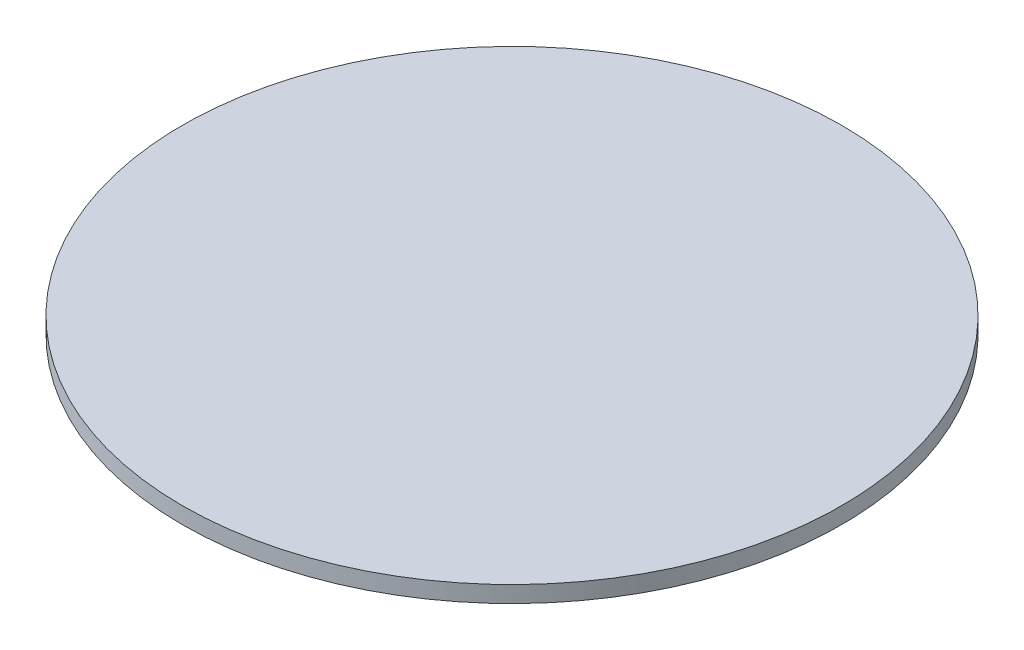
ISO-10303-21;
HEADER;
FILE_DESCRIPTION(('STEP AP214'),'2;1');
FILE_NAME('part.step','',(''),(''),'','','');
FILE_SCHEMA(('AUTOMOTIVE_DESIGN { 1 0 10303 214 1 1 1 1 }'));
ENDSEC;
DATA;
#1=APPLICATION_CONTEXT('core data for automotive mechanical design processes');
#2=APPLICATION_PROTOCOL_DEFINITION('international standard','automotive_design',2000,#1);
#3=PRODUCT_CONTEXT('',#1,'mechanical');
#4=PRODUCT('Part','Part','',(#3));
#5=PRODUCT_RELATED_PRODUCT_CATEGORY('part','',(#4));
#6=PRODUCT_DEFINITION_FORMATION('','',#4);
#7=PRODUCT_DEFINITION_CONTEXT('part definition',#1,'design');
#8=PRODUCT_DEFINITION('design','',#6,#7);
#9=PRODUCT_DEFINITION_SHAPE('','',#8);
#10=(LENGTH_UNIT() NAMED_UNIT(*) SI_UNIT(.MILLI.,.METRE.));
#11=(NAMED_UNIT(*) PLANE_ANGLE_UNIT() SI_UNIT($,.RADIAN.));
#12=(NAMED_UNIT(*) SI_UNIT($,.STERADIAN.) SOLID_ANGLE_UNIT());
#13=UNCERTAINTY_MEASURE_WITH_UNIT(LENGTH_MEASURE(1.E-05),#10,'distance_accuracy_value','');
#14=(GEOMETRIC_REPRESENTATION_CONTEXT(3) GLOBAL_UNCERTAINTY_ASSIGNED_CONTEXT((#13)) GLOBAL_UNIT_ASSIGNED_CONTEXT((#10,
#11,#12)) REPRESENTATION_CONTEXT('',''));
#15=CARTESIAN_POINT('',(0.,0.,0.));
#16=DIRECTION('',(0.,0.,1.));
#17=DIRECTION('',(1.,0.,0.));
#18=AXIS2_PLACEMENT_3D('',#15,#16,#17);
#19=CARTESIAN_POINT('',(0.,3.,0.));
#20=DIRECTION('',(0.,-1.,0.));
#21=DIRECTION('',(0.,0.,-1.));
#22=AXIS2_PLACEMENT_3D('',#19,#20,#21);
#23=CYLINDRICAL_SURFACE('',#22,60.);
#24=CARTESIAN_POINT('',(0.,3.,0.));
#25=DIRECTION('',(0.,1.,0.));
#26=DIRECTION('',(0.,0.,1.));
#27=AXIS2_PLACEMENT_3D('',#24,#25,#26);
#28=CIRCLE('',#27,60.);
#29=CARTESIAN_POINT('',(0.,3.,60.));
#30=VERTEX_POINT('',#29);
#31=EDGE_CURVE('E10',#30,#30,#28,.T.);
#32=ORIENTED_EDGE('',*,*,#31,.F.);
#33=EDGE_LOOP('',(#32));
#34=FACE_BOUND('',#33,.T.);
#35=CARTESIAN_POINT('',(0.,0.,0.));
#36=DIRECTION('',(0.,1.,0.));
#37=DIRECTION('',(0.,0.,1.));
#38=AXIS2_PLACEMENT_3D('',#35,#36,#37);
#39=CIRCLE('',#38,60.);
#40=CARTESIAN_POINT('',(0.,0.,60.));
#41=VERTEX_POINT('',#40);
#42=EDGE_CURVE('E38',#41,#41,#39,.T.);
#43=ORIENTED_EDGE('',*,*,#42,.T.);
#44=EDGE_LOOP('',(#43));
#45=FACE_BOUND('',#44,.T.);
#46=ADVANCED_FACE('F35',(#34,#45),#23,.T.);
#47=CARTESIAN_POINT('',(0.,3.,0.));
#48=DIRECTION('',(0.,1.,0.));
#49=DIRECTION('',(0.,0.,1.));
#50=AXIS2_PLACEMENT_3D('',#47,#48,#49);
#51=PLANE('',#50);
#52=ORIENTED_EDGE('',*,*,#31,.T.);
#53=EDGE_LOOP('',(#52));
#54=FACE_BOUND('',#53,.T.);
#55=ADVANCED_FACE('F50',(#54),#51,.T.);
#56=CARTESIAN_POINT('',(0.,0.,0.));
#57=DIRECTION('',(0.,1.,0.));
#58=DIRECTION('',(0.,0.,1.));
#59=AXIS2_PLACEMENT_3D('',#56,#57,#58);
#60=PLANE('',#59);
#61=ORIENTED_EDGE('',*,*,#42,.F.);
#62=EDGE_LOOP('',(#61));
#63=FACE_BOUND('',#62,.T.);
#64=ADVANCED_FACE('F48',(#63),#60,.F.);
#65=CLOSED_SHELL('',(#46,#55,#64));
#66=MANIFOLD_SOLID_BREP('B2',#65);
#67=ADVANCED_BREP_SHAPE_REPRESENTATION('',(#18,#66),#14);
#68=SHAPE_DEFINITION_REPRESENTATION(#9,#67);
ENDSEC;
END-ISO-10303-21;
